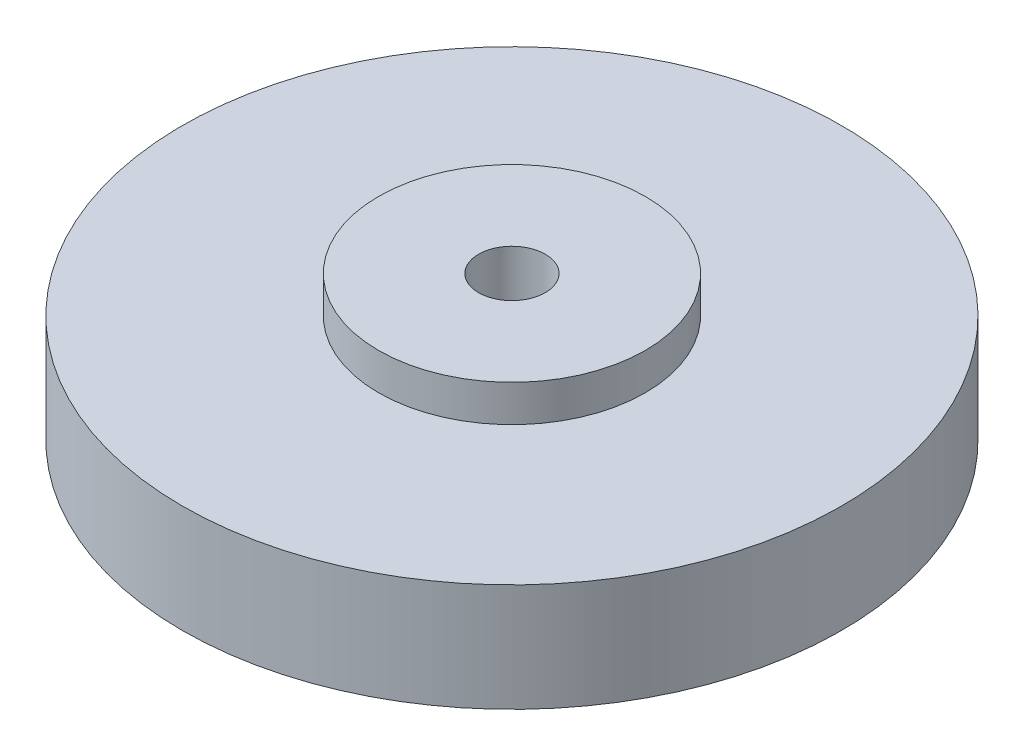
ISO-10303-21;
HEADER;
FILE_DESCRIPTION(('STEP AP214'),'2;1');
FILE_NAME('part.step','',(''),(''),'','','');
FILE_SCHEMA(('AUTOMOTIVE_DESIGN { 1 0 10303 214 1 1 1 1 }'));
ENDSEC;
DATA;
#1=APPLICATION_CONTEXT('core data for automotive mechanical design processes');
#2=APPLICATION_PROTOCOL_DEFINITION('international standard','automotive_design',2000,#1);
#3=PRODUCT_CONTEXT('',#1,'mechanical');
#4=PRODUCT('Part','Part','',(#3));
#5=PRODUCT_RELATED_PRODUCT_CATEGORY('part','',(#4));
#6=PRODUCT_DEFINITION_FORMATION('','',#4);
#7=PRODUCT_DEFINITION_CONTEXT('part definition',#1,'design');
#8=PRODUCT_DEFINITION('design','',#6,#7);
#9=PRODUCT_DEFINITION_SHAPE('','',#8);
#10=(LENGTH_UNIT() NAMED_UNIT(*) SI_UNIT(.MILLI.,.METRE.));
#11=(NAMED_UNIT(*) PLANE_ANGLE_UNIT() SI_UNIT($,.RADIAN.));
#12=(NAMED_UNIT(*) SI_UNIT($,.STERADIAN.) SOLID_ANGLE_UNIT());
#13=UNCERTAINTY_MEASURE_WITH_UNIT(LENGTH_MEASURE(1.E-05),#10,'distance_accuracy_value','');
#14=(GEOMETRIC_REPRESENTATION_CONTEXT(3) GLOBAL_UNCERTAINTY_ASSIGNED_CONTEXT((#13)) GLOBAL_UNIT_ASSIGNED_CONTEXT((#10,
#11,#12)) REPRESENTATION_CONTEXT('',''));
#15=CARTESIAN_POINT('',(0.,0.,0.));
#16=DIRECTION('',(0.,0.,1.));
#17=DIRECTION('',(1.,0.,0.));
#18=AXIS2_PLACEMENT_3D('',#15,#16,#17);
#19=CARTESIAN_POINT('',(0.,4.85,0.));
#20=DIRECTION('',(0.,-1.,0.));
#21=DIRECTION('',(0.,0.,-1.));
#22=AXIS2_PLACEMENT_3D('',#19,#20,#21);
#23=CYLINDRICAL_SURFACE('',#22,14.825);
#24=CARTESIAN_POINT('',(0.,4.85,0.));
#25=DIRECTION('',(0.,1.,0.));
#26=DIRECTION('',(0.,0.,1.));
#27=AXIS2_PLACEMENT_3D('',#24,#25,#26);
#28=CIRCLE('',#27,14.825);
#29=CARTESIAN_POINT('',(0.,4.85,14.825));
#30=VERTEX_POINT('',#29);
#31=EDGE_CURVE('E41',#30,#30,#28,.T.);
#32=ORIENTED_EDGE('',*,*,#31,.F.);
#33=EDGE_LOOP('',(#32));
#34=FACE_BOUND('',#33,.T.);
#35=CARTESIAN_POINT('',(0.,0.,0.));
#36=DIRECTION('',(0.,1.,0.));
#37=DIRECTION('',(0.,0.,1.));
#38=AXIS2_PLACEMENT_3D('',#35,#36,#37);
#39=CIRCLE('',#38,14.825);
#40=CARTESIAN_POINT('',(0.,0.,14.825));
#41=VERTEX_POINT('',#40);
#42=EDGE_CURVE('E37',#41,#41,#39,.T.);
#43=ORIENTED_EDGE('',*,*,#42,.T.);
#44=EDGE_LOOP('',(#43));
#45=FACE_BOUND('',#44,.T.);
#46=ADVANCED_FACE('F34',(#34,#45),#23,.T.);
#47=CARTESIAN_POINT('',(0.,4.85,0.));
#48=DIRECTION('',(0.,1.,0.));
#49=DIRECTION('',(0.,0.,1.));
#50=AXIS2_PLACEMENT_3D('',#47,#48,#49);
#51=PLANE('',#50);
#52=CARTESIAN_POINT('',(0.,4.85,0.));
#53=DIRECTION('',(0.,1.,0.));
#54=DIRECTION('',(0.,0.,1.));
#55=AXIS2_PLACEMENT_3D('',#52,#53,#54);
#56=CIRCLE('',#55,6.);
#57=CARTESIAN_POINT('',(0.,4.85,6.));
#58=VERTEX_POINT('',#57);
#59=EDGE_CURVE('E10',#58,#58,#56,.T.);
#60=ORIENTED_EDGE('',*,*,#59,.F.);
#61=EDGE_LOOP('',(#60));
#62=FACE_BOUND('',#61,.T.);
#63=ORIENTED_EDGE('',*,*,#31,.T.);
#64=EDGE_LOOP('',(#63));
#65=FACE_BOUND('',#64,.T.);
#66=ADVANCED_FACE('F78',(#62,#65),#51,.T.);
#67=CARTESIAN_POINT('',(0.,0.,0.));
#68=DIRECTION('',(0.,1.,0.));
#69=DIRECTION('',(0.,0.,1.));
#70=AXIS2_PLACEMENT_3D('',#67,#68,#69);
#71=PLANE('',#70);
#72=CARTESIAN_POINT('',(0.,0.,0.));
#73=DIRECTION('',(0.,1.,0.));
#74=DIRECTION('',(0.,0.,1.));
#75=AXIS2_PLACEMENT_3D('',#72,#73,#74);
#76=CIRCLE('',#75,1.5);
#77=CARTESIAN_POINT('',(0.,0.,1.5));
#78=VERTEX_POINT('',#77);
#79=EDGE_CURVE('E50',#78,#78,#76,.T.);
#80=ORIENTED_EDGE('',*,*,#79,.T.);
#81=EDGE_LOOP('',(#80));
#82=FACE_BOUND('',#81,.T.);
#83=ORIENTED_EDGE('',*,*,#42,.F.);
#84=EDGE_LOOP('',(#83));
#85=FACE_BOUND('',#84,.T.);
#86=ADVANCED_FACE('F57',(#82,#85),#71,.F.);
#87=CARTESIAN_POINT('',(0.,6.5,0.));
#88=DIRECTION('',(0.,-1.,0.));
#89=DIRECTION('',(0.,0.,-1.));
#90=AXIS2_PLACEMENT_3D('',#87,#88,#89);
#91=CYLINDRICAL_SURFACE('',#90,6.);
#92=CARTESIAN_POINT('',(0.,6.5,0.));
#93=DIRECTION('',(0.,1.,0.));
#94=DIRECTION('',(0.,0.,1.));
#95=AXIS2_PLACEMENT_3D('',#92,#93,#94);
#96=CIRCLE('',#95,6.);
#97=CARTESIAN_POINT('',(0.,6.5,6.));
#98=VERTEX_POINT('',#97);
#99=EDGE_CURVE('E47',#98,#98,#96,.T.);
#100=ORIENTED_EDGE('',*,*,#99,.F.);
#101=EDGE_LOOP('',(#100));
#102=FACE_BOUND('',#101,.T.);
#103=ORIENTED_EDGE('',*,*,#59,.T.);
#104=EDGE_LOOP('',(#103));
#105=FACE_BOUND('',#104,.T.);
#106=ADVANCED_FACE('F69',(#102,#105),#91,.T.);
#107=CARTESIAN_POINT('',(0.,6.5,0.));
#108=DIRECTION('',(0.,1.,0.));
#109=DIRECTION('',(0.,0.,1.));
#110=AXIS2_PLACEMENT_3D('',#107,#108,#109);
#111=PLANE('',#110);
#112=CARTESIAN_POINT('',(0.,6.5,0.));
#113=DIRECTION('',(0.,1.,0.));
#114=DIRECTION('',(0.,0.,1.));
#115=AXIS2_PLACEMENT_3D('',#112,#113,#114);
#116=CIRCLE('',#115,1.5);
#117=CARTESIAN_POINT('',(0.,6.5,1.5));
#118=VERTEX_POINT('',#117);
#119=EDGE_CURVE('E51',#118,#118,#116,.T.);
#120=ORIENTED_EDGE('',*,*,#119,.F.);
#121=EDGE_LOOP('',(#120));
#122=FACE_BOUND('',#121,.T.);
#123=ORIENTED_EDGE('',*,*,#99,.T.);
#124=EDGE_LOOP('',(#123));
#125=FACE_BOUND('',#124,.T.);
#126=ADVANCED_FACE('F63',(#122,#125),#111,.T.);
#127=CARTESIAN_POINT('',(0.,0.,0.));
#128=DIRECTION('',(0.,1.,0.));
#129=DIRECTION('',(0.,0.,1.));
#130=AXIS2_PLACEMENT_3D('',#127,#128,#129);
#131=CYLINDRICAL_SURFACE('',#130,1.5);
#132=ORIENTED_EDGE('',*,*,#79,.F.);
#133=EDGE_LOOP('',(#132));
#134=FACE_BOUND('',#133,.T.);
#135=ORIENTED_EDGE('',*,*,#119,.T.);
#136=EDGE_LOOP('',(#135));
#137=FACE_BOUND('',#136,.T.);
#138=ADVANCED_FACE('F60',(#134,#137),#131,.F.);
#139=CLOSED_SHELL('',(#46,#66,#86,#106,#126,#138));
#140=MANIFOLD_SOLID_BREP('B2',#139);
#141=ADVANCED_BREP_SHAPE_REPRESENTATION('',(#18,#140),#14);
#142=SHAPE_DEFINITION_REPRESENTATION(#9,#141);
ENDSEC;
END-ISO-10303-21;
